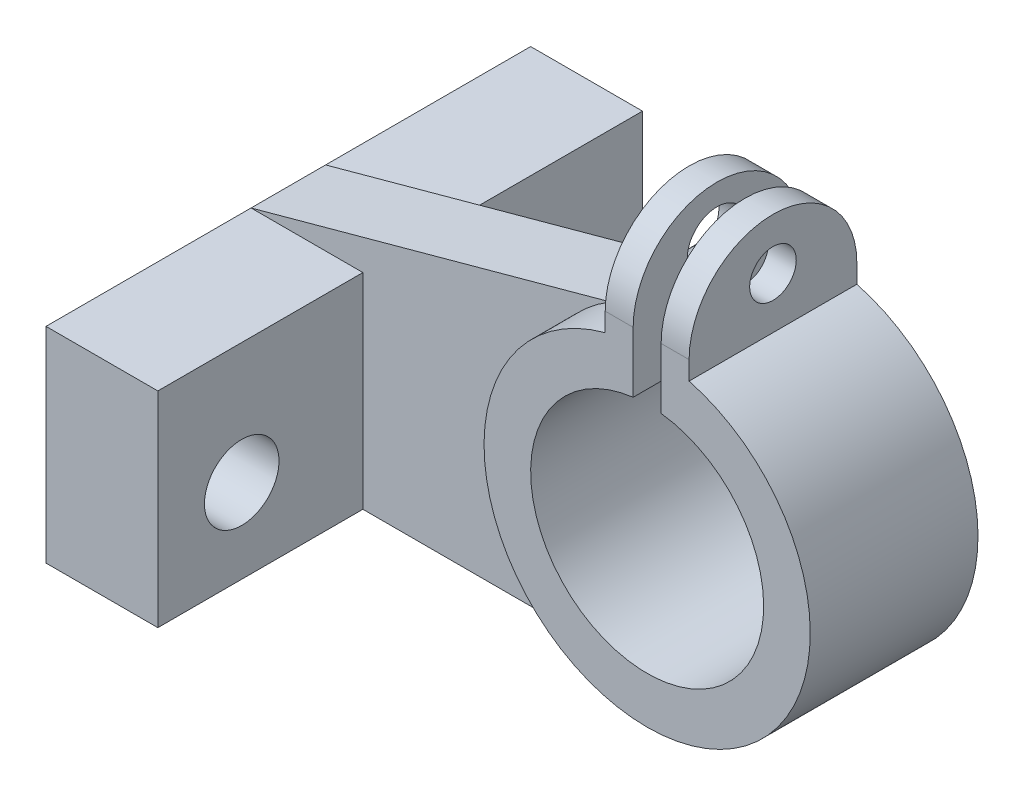
ISO-10303-21;
HEADER;
FILE_DESCRIPTION(('STEP AP214'),'2;1');
FILE_NAME('part.step','',(''),(''),'','','');
FILE_SCHEMA(('AUTOMOTIVE_DESIGN { 1 0 10303 214 1 1 1 1 }'));
ENDSEC;
DATA;
#1=APPLICATION_CONTEXT('core data for automotive mechanical design processes');
#2=APPLICATION_PROTOCOL_DEFINITION('international standard','automotive_design',2000,#1);
#3=PRODUCT_CONTEXT('',#1,'mechanical');
#4=PRODUCT('Part','Part','',(#3));
#5=PRODUCT_RELATED_PRODUCT_CATEGORY('part','',(#4));
#6=PRODUCT_DEFINITION_FORMATION('','',#4);
#7=PRODUCT_DEFINITION_CONTEXT('part definition',#1,'design');
#8=PRODUCT_DEFINITION('design','',#6,#7);
#9=PRODUCT_DEFINITION_SHAPE('','',#8);
#10=(LENGTH_UNIT() NAMED_UNIT(*) SI_UNIT(.MILLI.,.METRE.));
#11=(NAMED_UNIT(*) PLANE_ANGLE_UNIT() SI_UNIT($,.RADIAN.));
#12=(NAMED_UNIT(*) SI_UNIT($,.STERADIAN.) SOLID_ANGLE_UNIT());
#13=UNCERTAINTY_MEASURE_WITH_UNIT(LENGTH_MEASURE(1.E-05),#10,'distance_accuracy_value','');
#14=(GEOMETRIC_REPRESENTATION_CONTEXT(3) GLOBAL_UNCERTAINTY_ASSIGNED_CONTEXT((#13)) GLOBAL_UNIT_ASSIGNED_CONTEXT((#10,
#11,#12)) REPRESENTATION_CONTEXT('',''));
#15=CARTESIAN_POINT('',(0.,0.,0.));
#16=DIRECTION('',(0.,0.,1.));
#17=DIRECTION('',(1.,0.,0.));
#18=AXIS2_PLACEMENT_3D('',#15,#16,#17);
#19=CARTESIAN_POINT('',(-2.39474245110991E-07,-17.5000000000001,-26.));
#20=DIRECTION('',(1.36842425777709E-08,1.,0.));
#21=DIRECTION('',(-1.,1.36842425777709E-08,0.));
#22=AXIS2_PLACEMENT_3D('',#19,#20,#21);
#23=PLANE('',#22);
#24=DIRECTION('',(1.,-1.36842427070711E-08,0.));
#25=VECTOR('',#24,1.);
#26=CARTESIAN_POINT('',(-16.9115346533818,-17.5000000114739,-4.));
#27=LINE('',#26,#25);
#28=CARTESIAN_POINT('',(-35.5000005405276,-17.4999997571048,-4.));
#29=VERTEX_POINT('',#28);
#30=CARTESIAN_POINT('',(0.,-17.5,-4.));
#31=VERTEX_POINT('',#30);
#32=EDGE_CURVE('E414',#29,#31,#27,.T.);
#33=ORIENTED_EDGE('',*,*,#32,.T.);
#34=DIRECTION('',(0.,0.,1.));
#35=VECTOR('',#34,1.);
#36=CARTESIAN_POINT('',(-2.39474243605821E-07,-17.5000000000001,-26.));
#37=LINE('',#36,#35);
#38=CARTESIAN_POINT('',(0.,-17.5,4.));
#39=VERTEX_POINT('',#38);
#40=EDGE_CURVE('E271',#31,#39,#37,.T.);
#41=ORIENTED_EDGE('',*,*,#40,.T.);
#42=DIRECTION('',(-1.,1.36842427070712E-08,0.));
#43=VECTOR('',#42,1.);
#44=CARTESIAN_POINT('',(-16.9115346533819,-17.5000000114739,4.));
#45=LINE('',#44,#43);
#46=CARTESIAN_POINT('',(-35.5000005405276,-17.4999997571048,3.99999999999999));
#47=VERTEX_POINT('',#46);
#48=EDGE_CURVE('E410',#39,#47,#45,.T.);
#49=ORIENTED_EDGE('',*,*,#48,.T.);
#50=DIRECTION('',(0.,0.,-1.));
#51=VECTOR('',#50,1.);
#52=CARTESIAN_POINT('',(-35.4999994435739,-17.5000000000001,9.));
#53=LINE('',#52,#51);
#54=CARTESIAN_POINT('',(-35.4999994435739,-17.5000000000001,26.));
#55=VERTEX_POINT('',#54);
#56=EDGE_CURVE('E344',#55,#47,#53,.T.);
#57=ORIENTED_EDGE('',*,*,#56,.F.);
#58=DIRECTION('',(-1.,1.36842425777709E-08,0.));
#59=VECTOR('',#58,1.);
#60=CARTESIAN_POINT('',(-2.39474245110991E-07,-17.5000000000001,26.));
#61=LINE('',#60,#59);
#62=CARTESIAN_POINT('',(-41.5000002394742,-17.499999432104,26.));
#63=VERTEX_POINT('',#62);
#64=EDGE_CURVE('E253',#55,#63,#61,.T.);
#65=ORIENTED_EDGE('',*,*,#64,.T.);
#66=DIRECTION('',(-1.,0.,0.));
#67=VECTOR('',#66,1.);
#68=CARTESIAN_POINT('',(0.,-17.499999432104,26.));
#69=LINE('',#68,#67);
#70=CARTESIAN_POINT('',(-47.5000002394742,-17.499999432104,26.));
#71=VERTEX_POINT('',#70);
#72=EDGE_CURVE('E249',#63,#71,#69,.T.);
#73=ORIENTED_EDGE('',*,*,#72,.T.);
#74=DIRECTION('',(0.,0.,1.));
#75=VECTOR('',#74,1.);
#76=CARTESIAN_POINT('',(-47.5000002394742,-17.499999432104,-26.));
#77=LINE('',#76,#75);
#78=CARTESIAN_POINT('',(-47.5000002394742,-17.499999432104,-26.));
#79=VERTEX_POINT('',#78);
#80=EDGE_CURVE('E272',#79,#71,#77,.T.);
#81=ORIENTED_EDGE('',*,*,#80,.F.);
#82=DIRECTION('',(-1.,0.,0.));
#83=VECTOR('',#82,1.);
#84=CARTESIAN_POINT('',(0.,-17.499999432104,-26.));
#85=LINE('',#84,#83);
#86=CARTESIAN_POINT('',(-41.5000002394742,-17.499999432104,-26.));
#87=VERTEX_POINT('',#86);
#88=EDGE_CURVE('E260',#87,#79,#85,.T.);
#89=ORIENTED_EDGE('',*,*,#88,.F.);
#90=DIRECTION('',(-1.,1.36842425777709E-08,0.));
#91=VECTOR('',#90,1.);
#92=CARTESIAN_POINT('',(-2.39474245110991E-07,-17.5000000000001,-26.));
#93=LINE('',#92,#91);
#94=CARTESIAN_POINT('',(-35.499999443574,-17.4999995142095,-26.));
#95=VERTEX_POINT('',#94);
#96=EDGE_CURVE('E264',#95,#87,#93,.T.);
#97=ORIENTED_EDGE('',*,*,#96,.F.);
#98=DIRECTION('',(0.,0.,-1.));
#99=VECTOR('',#98,1.);
#100=CARTESIAN_POINT('',(-35.4999994435739,-17.5000000000001,-26.));
#101=LINE('',#100,#99);
#102=EDGE_CURVE('E354',#29,#95,#101,.T.);
#103=ORIENTED_EDGE('',*,*,#102,.F.);
#104=EDGE_LOOP('',(#33,#41,#49,#57,#65,#73,#81,#89,#97,#103));
#105=FACE_BOUND('',#104,.T.);
#106=ADVANCED_FACE('F63',(#105),#23,.F.);
#107=CARTESIAN_POINT('',(4.50000055642603,18.9096735787338,0.));
#108=DIRECTION('',(1.,0.,0.));
#109=DIRECTION('',(0.,1.,0.));
#110=AXIS2_PLACEMENT_3D('',#107,#108,#109);
#111=CYLINDRICAL_SURFACE('',#110,9.);
#112=DIRECTION('',(1.,0.,0.));
#113=VECTOR('',#112,1.);
#114=CARTESIAN_POINT('',(-35.499999443574,18.9096735787338,9.));
#115=LINE('',#114,#113);
#116=CARTESIAN_POINT('',(4.50000055642603,18.9096735787338,9.));
#117=VERTEX_POINT('',#116);
#118=CARTESIAN_POINT('',(1.50000055642603,18.9096735787338,9.));
#119=VERTEX_POINT('',#118);
#120=EDGE_CURVE('E318',#117,#119,#115,.F.);
#121=ORIENTED_EDGE('',*,*,#120,.F.);
#122=CARTESIAN_POINT('',(4.50000055642603,18.9096735787338,0.));
#123=DIRECTION('',(-1.,0.,0.));
#124=DIRECTION('',(0.,0.,1.));
#125=AXIS2_PLACEMENT_3D('',#122,#123,#124);
#126=CIRCLE('',#125,9.);
#127=CARTESIAN_POINT('',(4.50000055642603,18.9096735787338,-9.));
#128=VERTEX_POINT('',#127);
#129=EDGE_CURVE('E73',#128,#117,#126,.F.);
#130=ORIENTED_EDGE('',*,*,#129,.F.);
#131=DIRECTION('',(1.,0.,0.));
#132=VECTOR('',#131,1.);
#133=CARTESIAN_POINT('',(-35.499999443574,18.9096735787338,-9.));
#134=LINE('',#133,#132);
#135=CARTESIAN_POINT('',(1.50000055642603,18.9096735787338,-9.));
#136=VERTEX_POINT('',#135);
#137=EDGE_CURVE('E322',#136,#128,#134,.T.);
#138=ORIENTED_EDGE('',*,*,#137,.F.);
#139=CARTESIAN_POINT('',(1.50000055642603,18.9096735787338,0.));
#140=DIRECTION('',(-1.,0.,0.));
#141=DIRECTION('',(0.,0.,1.));
#142=AXIS2_PLACEMENT_3D('',#139,#140,#141);
#143=CIRCLE('',#142,9.);
#144=EDGE_CURVE('E13',#119,#136,#143,.T.);
#145=ORIENTED_EDGE('',*,*,#144,.F.);
#146=EDGE_LOOP('',(#121,#130,#138,#145));
#147=FACE_BOUND('',#146,.T.);
#148=ADVANCED_FACE('F66',(#147),#111,.T.);
#149=CARTESIAN_POINT('',(-1.49999944357397,18.9096737132481,0.));
#150=DIRECTION('',(1.,0.,0.));
#151=DIRECTION('',(0.,1.,0.));
#152=AXIS2_PLACEMENT_3D('',#149,#150,#151);
#153=CYLINDRICAL_SURFACE('',#152,9.);
#154=DIRECTION('',(-1.,0.,0.));
#155=VECTOR('',#154,1.);
#156=CARTESIAN_POINT('',(-1.49999944357397,18.9096737132481,9.));
#157=LINE('',#156,#155);
#158=CARTESIAN_POINT('',(-1.49999944357397,18.9096737132481,9.));
#159=VERTEX_POINT('',#158);
#160=CARTESIAN_POINT('',(-4.50000009358295,18.9096737132481,9.));
#161=VERTEX_POINT('',#160);
#162=EDGE_CURVE('E306',#159,#161,#157,.T.);
#163=ORIENTED_EDGE('',*,*,#162,.F.);
#164=CARTESIAN_POINT('',(-1.49999944357397,18.9096737132481,0.));
#165=DIRECTION('',(-1.,0.,0.));
#166=DIRECTION('',(0.,0.,1.));
#167=AXIS2_PLACEMENT_3D('',#164,#165,#166);
#168=CIRCLE('',#167,9.);
#169=CARTESIAN_POINT('',(-1.49999944357397,18.9096737132481,-9.));
#170=VERTEX_POINT('',#169);
#171=EDGE_CURVE('E312',#170,#159,#168,.F.);
#172=ORIENTED_EDGE('',*,*,#171,.F.);
#173=DIRECTION('',(-1.,0.,0.));
#174=VECTOR('',#173,1.);
#175=CARTESIAN_POINT('',(-1.49999944357397,18.9096737132481,-9.));
#176=LINE('',#175,#174);
#177=CARTESIAN_POINT('',(-4.50000009358295,18.9096737132481,-9.));
#178=VERTEX_POINT('',#177);
#179=EDGE_CURVE('E194',#178,#170,#176,.F.);
#180=ORIENTED_EDGE('',*,*,#179,.F.);
#181=CARTESIAN_POINT('',(-4.50000009358295,18.9096737132481,0.));
#182=DIRECTION('',(-1.,0.,0.));
#183=DIRECTION('',(0.,0.,1.));
#184=AXIS2_PLACEMENT_3D('',#181,#182,#183);
#185=CIRCLE('',#184,9.);
#186=EDGE_CURVE('E315',#161,#178,#185,.T.);
#187=ORIENTED_EDGE('',*,*,#186,.F.);
#188=EDGE_LOOP('',(#163,#172,#180,#187));
#189=FACE_BOUND('',#188,.T.);
#190=ADVANCED_FACE('F450',(#189),#153,.T.);
#191=CARTESIAN_POINT('',(-4.45425528148122,16.2785154620486,-26.));
#192=DIRECTION('',(0.263925827093045,-0.964542978717513,0.));
#193=DIRECTION('',(0.964542978717513,0.263925827093045,0.));
#194=AXIS2_PLACEMENT_3D('',#191,#192,#193);
#195=PLANE('',#194);
#196=DIRECTION('',(0.,0.,1.));
#197=VECTOR('',#196,1.);
#198=CARTESIAN_POINT('',(-8.91828109077376,15.0570336516178,-26.));
#199=LINE('',#198,#197);
#200=CARTESIAN_POINT('',(-8.91828107144067,15.0570336630687,-4.));
#201=VERTEX_POINT('',#200);
#202=CARTESIAN_POINT('',(-8.91828107144069,15.0570336630688,4.));
#203=VERTEX_POINT('',#202);
#204=EDGE_CURVE('E281',#201,#203,#199,.T.);
#205=ORIENTED_EDGE('',*,*,#204,.F.);
#206=DIRECTION('',(0.964542978717513,0.263925827093045,0.));
#207=VECTOR('',#206,1.);
#208=CARTESIAN_POINT('',(-4.45425528148122,16.2785154620486,-4.));
#209=LINE('',#208,#207);
#210=CARTESIAN_POINT('',(-47.5000002394743,4.50000065000149,-4.00000000000001));
#211=VERTEX_POINT('',#210);
#212=EDGE_CURVE('E303',#211,#201,#209,.T.);
#213=ORIENTED_EDGE('',*,*,#212,.F.);
#214=DIRECTION('',(0.,0.,1.));
#215=VECTOR('',#214,1.);
#216=CARTESIAN_POINT('',(-47.5000002394743,4.50000056789598,-26.));
#217=LINE('',#216,#215);
#218=CARTESIAN_POINT('',(-47.5000002394743,4.50000065000149,3.99999999999999));
#219=VERTEX_POINT('',#218);
#220=EDGE_CURVE('E280',#211,#219,#217,.T.);
#221=ORIENTED_EDGE('',*,*,#220,.T.);
#222=DIRECTION('',(-0.964542978717513,-0.263925827093045,0.));
#223=VECTOR('',#222,1.);
#224=CARTESIAN_POINT('',(-4.45425528148122,16.2785154620486,4.));
#225=LINE('',#224,#223);
#226=EDGE_CURVE('E299',#203,#219,#225,.T.);
#227=ORIENTED_EDGE('',*,*,#226,.F.);
#228=EDGE_LOOP('',(#205,#213,#221,#227));
#229=FACE_BOUND('',#228,.T.);
#230=ADVANCED_FACE('F484',(#229),#195,.F.);
#231=CARTESIAN_POINT('',(-35.4999994435739,-17.5000000000001,-9.));
#232=DIRECTION('',(0.,0.,1.));
#233=DIRECTION('',(1.,0.,0.));
#234=AXIS2_PLACEMENT_3D('',#231,#232,#233);
#235=PLANE('',#234);
#236=DIRECTION('',(0.,1.,0.));
#237=VECTOR('',#236,1.);
#238=CARTESIAN_POINT('',(-1.49999944357397,0.,-9.));
#239=LINE('',#238,#237);
#240=CARTESIAN_POINT('',(-1.49999944357397,12.4096735787338,-9.));
#241=VERTEX_POINT('',#240);
#242=EDGE_CURVE('E187',#241,#170,#239,.T.);
#243=ORIENTED_EDGE('',*,*,#242,.F.);
#244=CARTESIAN_POINT('',(0.,0.,-9.));
#245=DIRECTION('',(0.,0.,1.));
#246=DIRECTION('',(1.,0.,0.));
#247=AXIS2_PLACEMENT_3D('',#244,#245,#246);
#248=CIRCLE('',#247,12.5000000000001);
#249=CARTESIAN_POINT('',(1.50000055642603,12.4096735787338,-9.));
#250=VERTEX_POINT('',#249);
#251=EDGE_CURVE('E191',#250,#241,#248,.F.);
#252=ORIENTED_EDGE('',*,*,#251,.F.);
#253=DIRECTION('',(0.,1.,0.));
#254=VECTOR('',#253,1.);
#255=CARTESIAN_POINT('',(1.50000055642603,0.,-9.));
#256=LINE('',#255,#254);
#257=EDGE_CURVE('E86',#250,#136,#256,.T.);
#258=ORIENTED_EDGE('',*,*,#257,.T.);
#259=ORIENTED_EDGE('',*,*,#137,.T.);
#260=DIRECTION('',(0.,1.,0.));
#261=VECTOR('',#260,1.);
#262=CARTESIAN_POINT('',(4.50000055642603,0.,-9.));
#263=LINE('',#262,#261);
#264=CARTESIAN_POINT('',(4.50000055642603,16.9115343772281,-9.));
#265=VERTEX_POINT('',#264);
#266=EDGE_CURVE('E220',#265,#128,#263,.T.);
#267=ORIENTED_EDGE('',*,*,#266,.F.);
#268=CARTESIAN_POINT('',(0.,0.,-9.));
#269=DIRECTION('',(0.,0.,1.));
#270=DIRECTION('',(1.,0.,0.));
#271=AXIS2_PLACEMENT_3D('',#268,#269,#270);
#272=CIRCLE('',#271,17.5000000000001);
#273=CARTESIAN_POINT('',(-4.50000009358295,16.9115345003863,-9.));
#274=VERTEX_POINT('',#273);
#275=EDGE_CURVE('E226',#265,#274,#272,.F.);
#276=ORIENTED_EDGE('',*,*,#275,.T.);
#277=DIRECTION('',(0.,1.,0.));
#278=VECTOR('',#277,1.);
#279=CARTESIAN_POINT('',(-4.50000009358295,0.,-9.));
#280=LINE('',#279,#278);
#281=EDGE_CURVE('E198',#274,#178,#280,.T.);
#282=ORIENTED_EDGE('',*,*,#281,.T.);
#283=ORIENTED_EDGE('',*,*,#179,.T.);
#284=EDGE_LOOP('',(#243,#252,#258,#259,#267,#276,#282,#283));
#285=FACE_BOUND('',#284,.T.);
#286=ADVANCED_FACE('F189',(#285),#235,.F.);
#287=CARTESIAN_POINT('',(0.,0.,-26.));
#288=DIRECTION('',(0.,0.,1.));
#289=DIRECTION('',(1.,0.,0.));
#290=AXIS2_PLACEMENT_3D('',#287,#288,#289);
#291=PLANE('',#290);
#292=DIRECTION('',(1.,-1.36842426857557E-08,0.));
#293=VECTOR('',#292,1.);
#294=CARTESIAN_POINT('',(-47.5000002394743,4.50000065000149,-26.));
#295=LINE('',#294,#293);
#296=CARTESIAN_POINT('',(-47.5000002394743,4.50000065000149,-26.));
#297=VERTEX_POINT('',#296);
#298=CARTESIAN_POINT('',(-35.5000002394742,4.50000048579058,-26.));
#299=VERTEX_POINT('',#298);
#300=EDGE_CURVE('E377',#297,#299,#295,.T.);
#301=ORIENTED_EDGE('',*,*,#300,.T.);
#302=DIRECTION('',(0.,1.,0.));
#303=VECTOR('',#302,1.);
#304=CARTESIAN_POINT('',(-35.4999994435739,-17.5000000000001,-26.));
#305=LINE('',#304,#303);
#306=EDGE_CURVE('E348',#95,#299,#305,.T.);
#307=ORIENTED_EDGE('',*,*,#306,.F.);
#308=ORIENTED_EDGE('',*,*,#96,.T.);
#309=ORIENTED_EDGE('',*,*,#88,.T.);
#310=DIRECTION('',(0.,1.,0.));
#311=VECTOR('',#310,1.);
#312=CARTESIAN_POINT('',(-47.5000002394743,0.,-26.));
#313=LINE('',#312,#311);
#314=EDGE_CURVE('E267',#79,#297,#313,.T.);
#315=ORIENTED_EDGE('',*,*,#314,.T.);
#316=EDGE_LOOP('',(#301,#307,#308,#309,#315));
#317=FACE_BOUND('',#316,.T.);
#318=ADVANCED_FACE('F495',(#317),#291,.F.);
#319=CARTESIAN_POINT('',(-35.499999443574,0.,0.));
#320=DIRECTION('',(1.,0.,0.));
#321=DIRECTION('',(0.,1.,0.));
#322=AXIS2_PLACEMENT_3D('',#319,#320,#321);
#323=PLANE('',#322);
#324=CARTESIAN_POINT('',(-35.499999443574,-8.49999943210402,-17.));
#325=DIRECTION('',(-1.,0.,0.));
#326=DIRECTION('',(0.,0.,1.));
#327=AXIS2_PLACEMENT_3D('',#324,#325,#326);
#328=CIRCLE('',#327,4.);
#329=CARTESIAN_POINT('',(-35.499999443574,-8.49999943210402,-13.));
#330=VERTEX_POINT('',#329);
#331=EDGE_CURVE('E356',#330,#330,#328,.T.);
#332=ORIENTED_EDGE('',*,*,#331,.T.);
#333=EDGE_LOOP('',(#332));
#334=FACE_BOUND('',#333,.T.);
#335=ORIENTED_EDGE('',*,*,#306,.T.);
#336=DIRECTION('',(0.,0.,1.));
#337=VECTOR('',#336,1.);
#338=CARTESIAN_POINT('',(-35.5000002394742,4.50000048579058,-26.));
#339=LINE('',#338,#337);
#340=CARTESIAN_POINT('',(-35.5000002394743,4.50000048579057,-4.));
#341=VERTEX_POINT('',#340);
#342=EDGE_CURVE('E389',#299,#341,#339,.T.);
#343=ORIENTED_EDGE('',*,*,#342,.T.);
#344=DIRECTION('',(1.36842426857557E-08,1.,0.));
#345=VECTOR('',#344,1.);
#346=CARTESIAN_POINT('',(-35.5000005405276,-17.4999997571048,-4.));
#347=LINE('',#346,#345);
#348=EDGE_CURVE('E406',#29,#341,#347,.T.);
#349=ORIENTED_EDGE('',*,*,#348,.F.);
#350=ORIENTED_EDGE('',*,*,#102,.T.);
#351=EDGE_LOOP('',(#335,#343,#349,#350));
#352=FACE_BOUND('',#351,.T.);
#353=ADVANCED_FACE('F609',(#334,#352),#323,.T.);
#354=CARTESIAN_POINT('',(0.,0.,26.));
#355=DIRECTION('',(0.,0.,1.));
#356=DIRECTION('',(1.,0.,0.));
#357=AXIS2_PLACEMENT_3D('',#354,#355,#356);
#358=PLANE('',#357);
#359=DIRECTION('',(-1.,1.36842426857557E-08,0.));
#360=VECTOR('',#359,1.);
#361=CARTESIAN_POINT('',(-47.5000002394743,4.50000065000149,26.));
#362=LINE('',#361,#360);
#363=CARTESIAN_POINT('',(-35.499999443574,4.50000048579056,26.));
#364=VERTEX_POINT('',#363);
#365=CARTESIAN_POINT('',(-47.5000002394743,4.50000065000149,26.));
#366=VERTEX_POINT('',#365);
#367=EDGE_CURVE('E382',#364,#366,#362,.T.);
#368=ORIENTED_EDGE('',*,*,#367,.T.);
#369=DIRECTION('',(0.,1.,0.));
#370=VECTOR('',#369,1.);
#371=CARTESIAN_POINT('',(-47.5000002394743,0.,26.));
#372=LINE('',#371,#370);
#373=EDGE_CURVE('E256',#71,#366,#372,.T.);
#374=ORIENTED_EDGE('',*,*,#373,.F.);
#375=ORIENTED_EDGE('',*,*,#72,.F.);
#376=ORIENTED_EDGE('',*,*,#64,.F.);
#377=DIRECTION('',(0.,1.,0.));
#378=VECTOR('',#377,1.);
#379=CARTESIAN_POINT('',(-35.499999443574,0.,26.));
#380=LINE('',#379,#378);
#381=EDGE_CURVE('E275',#55,#364,#380,.T.);
#382=ORIENTED_EDGE('',*,*,#381,.T.);
#383=EDGE_LOOP('',(#368,#374,#375,#376,#382));
#384=FACE_BOUND('',#383,.T.);
#385=ADVANCED_FACE('F605',(#384),#358,.T.);
#386=CARTESIAN_POINT('',(-47.5000002394743,0.,-26.));
#387=DIRECTION('',(1.,0.,0.));
#388=DIRECTION('',(0.,1.,0.));
#389=AXIS2_PLACEMENT_3D('',#386,#387,#388);
#390=PLANE('',#389);
#391=CARTESIAN_POINT('',(-47.5000002394743,-8.49999943210402,-17.));
#392=DIRECTION('',(-1.,0.,0.));
#393=DIRECTION('',(0.,0.,1.));
#394=AXIS2_PLACEMENT_3D('',#391,#392,#393);
#395=CIRCLE('',#394,4.);
#396=CARTESIAN_POINT('',(-47.5000002394743,-8.49999943210402,-13.));
#397=VERTEX_POINT('',#396);
#398=EDGE_CURVE('E367',#397,#397,#395,.T.);
#399=ORIENTED_EDGE('',*,*,#398,.F.);
#400=EDGE_LOOP('',(#399));
#401=FACE_BOUND('',#400,.T.);
#402=CARTESIAN_POINT('',(-47.5000002394743,-8.49999943210402,17.));
#403=DIRECTION('',(-1.,0.,0.));
#404=DIRECTION('',(0.,0.,1.));
#405=AXIS2_PLACEMENT_3D('',#402,#403,#404);
#406=CIRCLE('',#405,4.);
#407=CARTESIAN_POINT('',(-47.5000002394743,-8.49999943210402,21.));
#408=VERTEX_POINT('',#407);
#409=EDGE_CURVE('E362',#408,#408,#406,.T.);
#410=ORIENTED_EDGE('',*,*,#409,.F.);
#411=EDGE_LOOP('',(#410));
#412=FACE_BOUND('',#411,.T.);
#413=ORIENTED_EDGE('',*,*,#80,.T.);
#414=ORIENTED_EDGE('',*,*,#373,.T.);
#415=DIRECTION('',(0.,0.,-1.));
#416=VECTOR('',#415,1.);
#417=CARTESIAN_POINT('',(-47.5000002394743,4.50000065000149,26.));
#418=LINE('',#417,#416);
#419=EDGE_CURVE('E374',#366,#219,#418,.T.);
#420=ORIENTED_EDGE('',*,*,#419,.T.);
#421=ORIENTED_EDGE('',*,*,#220,.F.);
#422=EDGE_CURVE('E276',#297,#211,#217,.T.);
#423=ORIENTED_EDGE('',*,*,#422,.F.);
#424=ORIENTED_EDGE('',*,*,#314,.F.);
#425=EDGE_LOOP('',(#413,#414,#420,#421,#423,#424));
#426=FACE_BOUND('',#425,.T.);
#427=ADVANCED_FACE('F500',(#401,#412,#426),#390,.F.);
#428=CARTESIAN_POINT('',(0.,0.,-26.));
#429=DIRECTION('',(0.,0.,1.));
#430=DIRECTION('',(1.,0.,0.));
#431=AXIS2_PLACEMENT_3D('',#428,#429,#430);
#432=CYLINDRICAL_SURFACE('',#431,17.5000000000001);
#433=DIRECTION('',(0.,0.,1.));
#434=VECTOR('',#433,1.);
#435=CARTESIAN_POINT('',(4.50000055642603,16.9115343772281,-26.));
#436=LINE('',#435,#434);
#437=CARTESIAN_POINT('',(4.50000055642603,16.9115343772281,9.));
#438=VERTEX_POINT('',#437);
#439=EDGE_CURVE('E288',#265,#438,#436,.T.);
#440=ORIENTED_EDGE('',*,*,#439,.T.);
#441=CARTESIAN_POINT('',(0.,0.,9.));
#442=DIRECTION('',(0.,0.,-1.));
#443=DIRECTION('',(0.,1.,0.));
#444=AXIS2_PLACEMENT_3D('',#441,#442,#443);
#445=CIRCLE('',#444,17.5000000000001);
#446=CARTESIAN_POINT('',(-4.50000009358295,16.9115345003863,9.));
#447=VERTEX_POINT('',#446);
#448=EDGE_CURVE('E245',#447,#438,#445,.F.);
#449=ORIENTED_EDGE('',*,*,#448,.F.);
#450=DIRECTION('',(0.,0.,1.));
#451=VECTOR('',#450,1.);
#452=CARTESIAN_POINT('',(-4.50000009358295,16.9115345003863,-26.));
#453=LINE('',#452,#451);
#454=EDGE_CURVE('E209',#274,#447,#453,.T.);
#455=ORIENTED_EDGE('',*,*,#454,.F.);
#456=ORIENTED_EDGE('',*,*,#275,.F.);
#457=EDGE_LOOP('',(#440,#449,#455,#456));
#458=FACE_BOUND('',#457,.T.);
#459=CARTESIAN_POINT('',(0.,0.,-4.));
#460=DIRECTION('',(0.,0.,1.));
#461=DIRECTION('',(-1.,0.,0.));
#462=AXIS2_PLACEMENT_3D('',#459,#460,#461);
#463=CIRCLE('',#462,17.5);
#464=EDGE_CURVE('E398',#201,#31,#463,.T.);
#465=ORIENTED_EDGE('',*,*,#464,.F.);
#466=ORIENTED_EDGE('',*,*,#204,.T.);
#467=CARTESIAN_POINT('',(0.,0.,4.));
#468=DIRECTION('',(0.,0.,-1.));
#469=DIRECTION('',(1.,0.,0.));
#470=AXIS2_PLACEMENT_3D('',#467,#468,#469);
#471=CIRCLE('',#470,17.5000000000001);
#472=EDGE_CURVE('E386',#39,#203,#471,.T.);
#473=ORIENTED_EDGE('',*,*,#472,.F.);
#474=ORIENTED_EDGE('',*,*,#40,.F.);
#475=EDGE_LOOP('',(#465,#466,#473,#474));
#476=FACE_BOUND('',#475,.T.);
#477=ADVANCED_FACE('F340',(#458,#476),#432,.T.);
#478=CARTESIAN_POINT('',(-4.50000009358295,0.,-26.));
#479=DIRECTION('',(-1.,0.,0.));
#480=DIRECTION('',(0.,0.,1.));
#481=AXIS2_PLACEMENT_3D('',#478,#479,#480);
#482=PLANE('',#481);
#483=CARTESIAN_POINT('',(-4.50000009358295,22.4106040395601,0.));
#484=DIRECTION('',(-1.,0.,0.));
#485=DIRECTION('',(0.,0.,1.));
#486=AXIS2_PLACEMENT_3D('',#483,#484,#485);
#487=CIRCLE('',#486,3.2);
#488=CARTESIAN_POINT('',(-4.50000009358295,22.4106040395601,3.2));
#489=VERTEX_POINT('',#488);
#490=EDGE_CURVE('E426',#489,#489,#487,.T.);
#491=ORIENTED_EDGE('',*,*,#490,.F.);
#492=EDGE_LOOP('',(#491));
#493=FACE_BOUND('',#492,.T.);
#494=DIRECTION('',(0.,-1.,0.));
#495=VECTOR('',#494,1.);
#496=CARTESIAN_POINT('',(-4.50000009358295,0.,9.));
#497=LINE('',#496,#495);
#498=EDGE_CURVE('E241',#161,#447,#497,.T.);
#499=ORIENTED_EDGE('',*,*,#498,.F.);
#500=ORIENTED_EDGE('',*,*,#186,.T.);
#501=ORIENTED_EDGE('',*,*,#281,.F.);
#502=ORIENTED_EDGE('',*,*,#454,.T.);
#503=EDGE_LOOP('',(#499,#500,#501,#502));
#504=FACE_BOUND('',#503,.T.);
#505=ADVANCED_FACE('F444',(#493,#504),#482,.T.);
#506=CARTESIAN_POINT('',(-1.49999944357397,0.,-26.));
#507=DIRECTION('',(-1.,0.,0.));
#508=DIRECTION('',(0.,0.,1.));
#509=AXIS2_PLACEMENT_3D('',#506,#507,#508);
#510=PLANE('',#509);
#511=CARTESIAN_POINT('',(-1.49999944357397,22.4106040395601,0.));
#512=DIRECTION('',(-1.,0.,0.));
#513=DIRECTION('',(0.,0.,1.));
#514=AXIS2_PLACEMENT_3D('',#511,#512,#513);
#515=CIRCLE('',#514,3.2);
#516=CARTESIAN_POINT('',(-1.49999944357397,22.4106040395601,3.2));
#517=VERTEX_POINT('',#516);
#518=EDGE_CURVE('E419',#517,#517,#515,.T.);
#519=ORIENTED_EDGE('',*,*,#518,.T.);
#520=EDGE_LOOP('',(#519));
#521=FACE_BOUND('',#520,.T.);
#522=ORIENTED_EDGE('',*,*,#171,.T.);
#523=DIRECTION('',(0.,-1.,0.));
#524=VECTOR('',#523,1.);
#525=CARTESIAN_POINT('',(-1.49999944357397,0.,9.));
#526=LINE('',#525,#524);
#527=CARTESIAN_POINT('',(-1.49999944357397,12.4096735787338,9.));
#528=VERTEX_POINT('',#527);
#529=EDGE_CURVE('E204',#159,#528,#526,.T.);
#530=ORIENTED_EDGE('',*,*,#529,.T.);
#531=DIRECTION('',(0.,0.,1.));
#532=VECTOR('',#531,1.);
#533=CARTESIAN_POINT('',(-1.49999944357397,12.4096737132481,-26.));
#534=LINE('',#533,#532);
#535=EDGE_CURVE('E201',#241,#528,#534,.T.);
#536=ORIENTED_EDGE('',*,*,#535,.F.);
#537=ORIENTED_EDGE('',*,*,#242,.T.);
#538=EDGE_LOOP('',(#522,#530,#536,#537));
#539=FACE_BOUND('',#538,.T.);
#540=ADVANCED_FACE('F202',(#521,#539),#510,.F.);
#541=CARTESIAN_POINT('',(0.,0.,-26.));
#542=DIRECTION('',(0.,0.,1.));
#543=DIRECTION('',(1.,0.,0.));
#544=AXIS2_PLACEMENT_3D('',#541,#542,#543);
#545=CYLINDRICAL_SURFACE('',#544,12.5000000000001);
#546=CARTESIAN_POINT('',(0.,0.,9.));
#547=DIRECTION('',(0.,0.,-1.));
#548=DIRECTION('',(0.,1.,0.));
#549=AXIS2_PLACEMENT_3D('',#546,#547,#548);
#550=CIRCLE('',#549,12.5000000000001);
#551=CARTESIAN_POINT('',(1.50000055642603,12.4096735787338,9.));
#552=VERTEX_POINT('',#551);
#553=EDGE_CURVE('E236',#528,#552,#550,.F.);
#554=ORIENTED_EDGE('',*,*,#553,.T.);
#555=DIRECTION('',(0.,0.,1.));
#556=VECTOR('',#555,1.);
#557=CARTESIAN_POINT('',(1.50000055642603,12.4096735787338,-26.));
#558=LINE('',#557,#556);
#559=EDGE_CURVE('E210',#250,#552,#558,.T.);
#560=ORIENTED_EDGE('',*,*,#559,.F.);
#561=ORIENTED_EDGE('',*,*,#251,.T.);
#562=ORIENTED_EDGE('',*,*,#535,.T.);
#563=EDGE_LOOP('',(#554,#560,#561,#562));
#564=FACE_BOUND('',#563,.T.);
#565=ADVANCED_FACE('F213',(#564),#545,.F.);
#566=CARTESIAN_POINT('',(1.50000055642603,0.,-26.));
#567=DIRECTION('',(-1.,0.,0.));
#568=DIRECTION('',(0.,0.,1.));
#569=AXIS2_PLACEMENT_3D('',#566,#567,#568);
#570=PLANE('',#569);
#571=ORIENTED_EDGE('',*,*,#144,.T.);
#572=ORIENTED_EDGE('',*,*,#257,.F.);
#573=ORIENTED_EDGE('',*,*,#559,.T.);
#574=DIRECTION('',(0.,-1.,0.));
#575=VECTOR('',#574,1.);
#576=CARTESIAN_POINT('',(1.50000055642603,0.,9.));
#577=LINE('',#576,#575);
#578=EDGE_CURVE('E233',#119,#552,#577,.T.);
#579=ORIENTED_EDGE('',*,*,#578,.F.);
#580=EDGE_LOOP('',(#571,#572,#573,#579));
#581=FACE_BOUND('',#580,.T.);
#582=CARTESIAN_POINT('',(1.50000055642604,22.410603977981,0.));
#583=DIRECTION('',(1.,0.,0.));
#584=DIRECTION('',(0.,1.,0.));
#585=AXIS2_PLACEMENT_3D('',#582,#583,#584);
#586=CIRCLE('',#585,2.5);
#587=CARTESIAN_POINT('',(1.50000055642603,24.910603977981,0.));
#588=VERTEX_POINT('',#587);
#589=EDGE_CURVE('E401',#588,#588,#586,.T.);
#590=ORIENTED_EDGE('',*,*,#589,.T.);
#591=EDGE_LOOP('',(#590));
#592=FACE_BOUND('',#591,.T.);
#593=ADVANCED_FACE('F452',(#581,#592),#570,.T.);
#594=CARTESIAN_POINT('',(4.50000055642603,0.,-26.));
#595=DIRECTION('',(-1.,0.,0.));
#596=DIRECTION('',(0.,0.,1.));
#597=AXIS2_PLACEMENT_3D('',#594,#595,#596);
#598=PLANE('',#597);
#599=CARTESIAN_POINT('',(4.50000055642601,22.410603977981,0.));
#600=DIRECTION('',(1.,0.,0.));
#601=DIRECTION('',(0.,1.,0.));
#602=AXIS2_PLACEMENT_3D('',#599,#600,#601);
#603=CIRCLE('',#602,2.5);
#604=CARTESIAN_POINT('',(4.50000055642601,24.910603977981,0.));
#605=VERTEX_POINT('',#604);
#606=EDGE_CURVE('E402',#605,#605,#603,.T.);
#607=ORIENTED_EDGE('',*,*,#606,.F.);
#608=EDGE_LOOP('',(#607));
#609=FACE_BOUND('',#608,.T.);
#610=ORIENTED_EDGE('',*,*,#266,.T.);
#611=ORIENTED_EDGE('',*,*,#129,.T.);
#612=DIRECTION('',(0.,-1.,0.));
#613=VECTOR('',#612,1.);
#614=CARTESIAN_POINT('',(4.50000055642603,0.,9.));
#615=LINE('',#614,#613);
#616=EDGE_CURVE('E229',#117,#438,#615,.T.);
#617=ORIENTED_EDGE('',*,*,#616,.T.);
#618=ORIENTED_EDGE('',*,*,#439,.F.);
#619=EDGE_LOOP('',(#610,#611,#617,#618));
#620=FACE_BOUND('',#619,.T.);
#621=ADVANCED_FACE('F329',(#609,#620),#598,.F.);
#622=CARTESIAN_POINT('',(-35.4999994435739,-17.5000000000001,9.));
#623=DIRECTION('',(0.,0.,-1.));
#624=DIRECTION('',(0.,1.,0.));
#625=AXIS2_PLACEMENT_3D('',#622,#623,#624);
#626=PLANE('',#625);
#627=ORIENTED_EDGE('',*,*,#553,.F.);
#628=ORIENTED_EDGE('',*,*,#529,.F.);
#629=ORIENTED_EDGE('',*,*,#162,.T.);
#630=ORIENTED_EDGE('',*,*,#498,.T.);
#631=ORIENTED_EDGE('',*,*,#448,.T.);
#632=ORIENTED_EDGE('',*,*,#616,.F.);
#633=ORIENTED_EDGE('',*,*,#120,.T.);
#634=ORIENTED_EDGE('',*,*,#578,.T.);
#635=EDGE_LOOP('',(#627,#628,#629,#630,#631,#632,#633,#634));
#636=FACE_BOUND('',#635,.T.);
#637=ADVANCED_FACE('F335',(#636),#626,.F.);
#638=CARTESIAN_POINT('',(-35.499999443574,0.,0.));
#639=DIRECTION('',(1.,0.,0.));
#640=DIRECTION('',(0.,1.,0.));
#641=AXIS2_PLACEMENT_3D('',#638,#639,#640);
#642=PLANE('',#641);
#643=DIRECTION('',(0.,0.,-1.));
#644=VECTOR('',#643,1.);
#645=CARTESIAN_POINT('',(-35.499999443574,4.50000048579056,0.));
#646=LINE('',#645,#644);
#647=CARTESIAN_POINT('',(-35.5000002394743,4.50000048579057,3.99999999999999));
#648=VERTEX_POINT('',#647);
#649=EDGE_CURVE('E296',#364,#648,#646,.T.);
#650=ORIENTED_EDGE('',*,*,#649,.F.);
#651=ORIENTED_EDGE('',*,*,#381,.F.);
#652=ORIENTED_EDGE('',*,*,#56,.T.);
#653=DIRECTION('',(1.36842426857557E-08,1.,0.));
#654=VECTOR('',#653,1.);
#655=CARTESIAN_POINT('',(-35.5000005405276,-17.4999997571048,3.99999999999999));
#656=LINE('',#655,#654);
#657=EDGE_CURVE('E415',#47,#648,#656,.T.);
#658=ORIENTED_EDGE('',*,*,#657,.T.);
#659=EDGE_LOOP('',(#650,#651,#652,#658));
#660=FACE_BOUND('',#659,.T.);
#661=CARTESIAN_POINT('',(-35.499999443574,-8.49999943210402,17.));
#662=DIRECTION('',(-1.,0.,0.));
#663=DIRECTION('',(0.,0.,1.));
#664=AXIS2_PLACEMENT_3D('',#661,#662,#663);
#665=CIRCLE('',#664,4.);
#666=CARTESIAN_POINT('',(-35.499999443574,-8.49999943210402,21.));
#667=VERTEX_POINT('',#666);
#668=EDGE_CURVE('E358',#667,#667,#665,.T.);
#669=ORIENTED_EDGE('',*,*,#668,.T.);
#670=EDGE_LOOP('',(#669));
#671=FACE_BOUND('',#670,.T.);
#672=ADVANCED_FACE('F471',(#660,#671),#642,.T.);
#673=CARTESIAN_POINT('',(-35.499999443574,-8.49999943210402,-17.));
#674=DIRECTION('',(-1.,0.,0.));
#675=DIRECTION('',(0.,0.,1.));
#676=AXIS2_PLACEMENT_3D('',#673,#674,#675);
#677=CYLINDRICAL_SURFACE('',#676,4.);
#678=ORIENTED_EDGE('',*,*,#331,.F.);
#679=EDGE_LOOP('',(#678));
#680=FACE_BOUND('',#679,.T.);
#681=ORIENTED_EDGE('',*,*,#398,.T.);
#682=EDGE_LOOP('',(#681));
#683=FACE_BOUND('',#682,.T.);
#684=ADVANCED_FACE('F629',(#680,#683),#677,.F.);
#685=CARTESIAN_POINT('',(-35.499999443574,-8.49999943210402,17.));
#686=DIRECTION('',(-1.,0.,0.));
#687=DIRECTION('',(0.,0.,1.));
#688=AXIS2_PLACEMENT_3D('',#685,#686,#687);
#689=CYLINDRICAL_SURFACE('',#688,4.);
#690=ORIENTED_EDGE('',*,*,#668,.F.);
#691=EDGE_LOOP('',(#690));
#692=FACE_BOUND('',#691,.T.);
#693=ORIENTED_EDGE('',*,*,#409,.T.);
#694=EDGE_LOOP('',(#693));
#695=FACE_BOUND('',#694,.T.);
#696=ADVANCED_FACE('F641',(#692,#695),#689,.F.);
#697=CARTESIAN_POINT('',(-47.5000002394743,4.50000065000149,-4.00000000000001));
#698=DIRECTION('',(0.,0.,-1.));
#699=DIRECTION('',(-1.,0.,0.));
#700=AXIS2_PLACEMENT_3D('',#697,#698,#699);
#701=PLANE('',#700);
#702=ORIENTED_EDGE('',*,*,#464,.T.);
#703=ORIENTED_EDGE('',*,*,#32,.F.);
#704=ORIENTED_EDGE('',*,*,#348,.T.);
#705=DIRECTION('',(-1.,1.36842426857557E-08,0.));
#706=VECTOR('',#705,1.);
#707=CARTESIAN_POINT('',(-47.5000002394743,4.50000065000149,-4.00000000000001));
#708=LINE('',#707,#706);
#709=EDGE_CURVE('E363',#341,#211,#708,.T.);
#710=ORIENTED_EDGE('',*,*,#709,.T.);
#711=ORIENTED_EDGE('',*,*,#212,.T.);
#712=EDGE_LOOP('',(#702,#703,#704,#710,#711));
#713=FACE_BOUND('',#712,.T.);
#714=ADVANCED_FACE('F651',(#713),#701,.T.);
#715=CARTESIAN_POINT('',(6.15790940296261E-08,4.49999999999996,0.));
#716=DIRECTION('',(1.36842426857557E-08,1.,0.));
#717=DIRECTION('',(-1.,1.36842426857557E-08,0.));
#718=AXIS2_PLACEMENT_3D('',#715,#716,#717);
#719=PLANE('',#718);
#720=ORIENTED_EDGE('',*,*,#709,.F.);
#721=ORIENTED_EDGE('',*,*,#342,.F.);
#722=ORIENTED_EDGE('',*,*,#300,.F.);
#723=ORIENTED_EDGE('',*,*,#422,.T.);
#724=EDGE_LOOP('',(#720,#721,#722,#723));
#725=FACE_BOUND('',#724,.T.);
#726=ADVANCED_FACE('F557',(#725),#719,.T.);
#727=CARTESIAN_POINT('',(-47.5000002394743,4.50000065000149,3.99999999999999));
#728=DIRECTION('',(0.,0.,1.));
#729=DIRECTION('',(1.,0.,0.));
#730=AXIS2_PLACEMENT_3D('',#727,#728,#729);
#731=PLANE('',#730);
#732=ORIENTED_EDGE('',*,*,#48,.F.);
#733=ORIENTED_EDGE('',*,*,#472,.T.);
#734=ORIENTED_EDGE('',*,*,#226,.T.);
#735=DIRECTION('',(1.,-1.36842426857557E-08,0.));
#736=VECTOR('',#735,1.);
#737=CARTESIAN_POINT('',(-47.5000002394743,4.50000065000149,3.99999999999999));
#738=LINE('',#737,#736);
#739=EDGE_CURVE('E378',#219,#648,#738,.T.);
#740=ORIENTED_EDGE('',*,*,#739,.T.);
#741=ORIENTED_EDGE('',*,*,#657,.F.);
#742=EDGE_LOOP('',(#732,#733,#734,#740,#741));
#743=FACE_BOUND('',#742,.T.);
#744=ADVANCED_FACE('F555',(#743),#731,.T.);
#745=CARTESIAN_POINT('',(6.15790940296261E-08,4.49999999999996,0.));
#746=DIRECTION('',(-1.36842426857557E-08,-1.,0.));
#747=DIRECTION('',(1.,-1.36842426857557E-08,0.));
#748=AXIS2_PLACEMENT_3D('',#745,#746,#747);
#749=PLANE('',#748);
#750=ORIENTED_EDGE('',*,*,#649,.T.);
#751=ORIENTED_EDGE('',*,*,#739,.F.);
#752=ORIENTED_EDGE('',*,*,#419,.F.);
#753=ORIENTED_EDGE('',*,*,#367,.F.);
#754=EDGE_LOOP('',(#750,#751,#752,#753));
#755=FACE_BOUND('',#754,.T.);
#756=ADVANCED_FACE('F460',(#755),#749,.F.);
#757=CARTESIAN_POINT('',(1.50000055642604,22.410603977981,0.));
#758=DIRECTION('',(1.,0.,0.));
#759=DIRECTION('',(0.,1.,0.));
#760=AXIS2_PLACEMENT_3D('',#757,#758,#759);
#761=CYLINDRICAL_SURFACE('',#760,2.5);
#762=ORIENTED_EDGE('',*,*,#589,.F.);
#763=EDGE_LOOP('',(#762));
#764=FACE_BOUND('',#763,.T.);
#765=ORIENTED_EDGE('',*,*,#606,.T.);
#766=EDGE_LOOP('',(#765));
#767=FACE_BOUND('',#766,.T.);
#768=ADVANCED_FACE('F440',(#764,#767),#761,.F.);
#769=CARTESIAN_POINT('',(-1.49999944357397,22.4106040395601,0.));
#770=DIRECTION('',(-1.,0.,0.));
#771=DIRECTION('',(0.,0.,1.));
#772=AXIS2_PLACEMENT_3D('',#769,#770,#771);
#773=CYLINDRICAL_SURFACE('',#772,3.2);
#774=ORIENTED_EDGE('',*,*,#518,.F.);
#775=EDGE_LOOP('',(#774));
#776=FACE_BOUND('',#775,.T.);
#777=ORIENTED_EDGE('',*,*,#490,.T.);
#778=EDGE_LOOP('',(#777));
#779=FACE_BOUND('',#778,.T.);
#780=ADVANCED_FACE('F437',(#776,#779),#773,.F.);
#781=CLOSED_SHELL('',(#106,#148,#190,#230,#286,#318,#353,#385,#427,#477,#505,#540,#565,#593,
#621,#637,#672,#684,#696,#714,#726,#744,#756,#768,#780));
#782=MANIFOLD_SOLID_BREP('B2',#781);
#783=ADVANCED_BREP_SHAPE_REPRESENTATION('',(#18,#782),#14);
#784=SHAPE_DEFINITION_REPRESENTATION(#9,#783);
ENDSEC;
END-ISO-10303-21;
